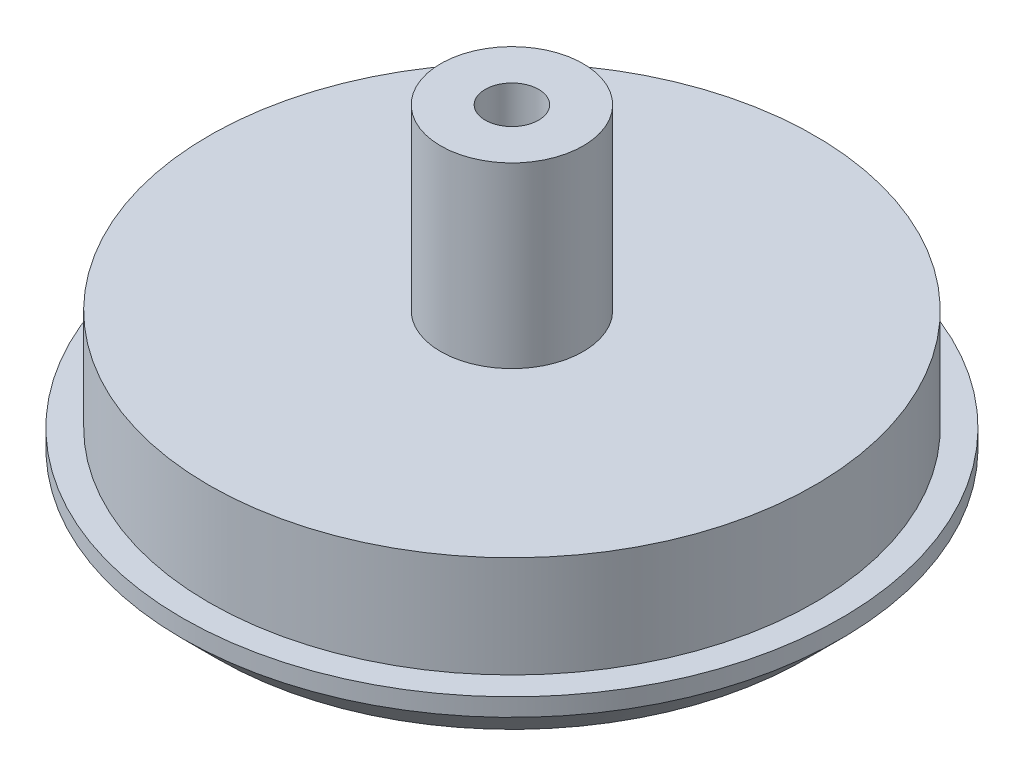
ISO-10303-21;
HEADER;
FILE_DESCRIPTION(('STEP AP214'),'2;1');
FILE_NAME('part.step','',(''),(''),'','','');
FILE_SCHEMA(('AUTOMOTIVE_DESIGN { 1 0 10303 214 1 1 1 1 }'));
ENDSEC;
DATA;
#1=APPLICATION_CONTEXT('core data for automotive mechanical design processes');
#2=APPLICATION_PROTOCOL_DEFINITION('international standard','automotive_design',2000,#1);
#3=PRODUCT_CONTEXT('',#1,'mechanical');
#4=PRODUCT('Part','Part','',(#3));
#5=PRODUCT_RELATED_PRODUCT_CATEGORY('part','',(#4));
#6=PRODUCT_DEFINITION_FORMATION('','',#4);
#7=PRODUCT_DEFINITION_CONTEXT('part definition',#1,'design');
#8=PRODUCT_DEFINITION('design','',#6,#7);
#9=PRODUCT_DEFINITION_SHAPE('','',#8);
#10=(LENGTH_UNIT() NAMED_UNIT(*) SI_UNIT(.MILLI.,.METRE.));
#11=(NAMED_UNIT(*) PLANE_ANGLE_UNIT() SI_UNIT($,.RADIAN.));
#12=(NAMED_UNIT(*) SI_UNIT($,.STERADIAN.) SOLID_ANGLE_UNIT());
#13=UNCERTAINTY_MEASURE_WITH_UNIT(LENGTH_MEASURE(1.E-05),#10,'distance_accuracy_value','');
#14=(GEOMETRIC_REPRESENTATION_CONTEXT(3) GLOBAL_UNCERTAINTY_ASSIGNED_CONTEXT((#13)) GLOBAL_UNIT_ASSIGNED_CONTEXT((#10,
#11,#12)) REPRESENTATION_CONTEXT('',''));
#15=CARTESIAN_POINT('',(0.,0.,0.));
#16=DIRECTION('',(0.,0.,1.));
#17=DIRECTION('',(1.,0.,0.));
#18=AXIS2_PLACEMENT_3D('',#15,#16,#17);
#19=CARTESIAN_POINT('',(0.,8.7,0.));
#20=DIRECTION('',(0.,-1.,0.));
#21=DIRECTION('',(0.,0.,-1.));
#22=AXIS2_PLACEMENT_3D('',#19,#20,#21);
#23=CYLINDRICAL_SURFACE('',#22,18.5);
#24=CARTESIAN_POINT('',(0.,2.00000000000001,0.));
#25=DIRECTION('',(0.,1.,0.));
#26=DIRECTION('',(0.,0.,1.));
#27=AXIS2_PLACEMENT_3D('',#24,#25,#26);
#28=CIRCLE('',#27,18.5);
#29=CARTESIAN_POINT('',(0.,2.00000000000001,18.5));
#30=VERTEX_POINT('',#29);
#31=EDGE_CURVE('E40',#30,#30,#28,.T.);
#32=ORIENTED_EDGE('',*,*,#31,.T.);
#33=EDGE_LOOP('',(#32));
#34=FACE_BOUND('',#33,.T.);
#35=CARTESIAN_POINT('',(0.,3.,0.));
#36=DIRECTION('',(0.,1.,0.));
#37=DIRECTION('',(0.,0.,1.));
#38=AXIS2_PLACEMENT_3D('',#35,#36,#37);
#39=CIRCLE('',#38,18.5);
#40=CARTESIAN_POINT('',(0.,3.,18.5));
#41=VERTEX_POINT('',#40);
#42=EDGE_CURVE('E53',#41,#41,#39,.F.);
#43=ORIENTED_EDGE('',*,*,#42,.T.);
#44=EDGE_LOOP('',(#43));
#45=FACE_BOUND('',#44,.T.);
#46=ADVANCED_FACE('F33',(#34,#45),#23,.T.);
#47=CARTESIAN_POINT('',(0.,0.,0.));
#48=DIRECTION('',(0.,1.,0.));
#49=DIRECTION('',(0.,0.,1.));
#50=AXIS2_PLACEMENT_3D('',#47,#48,#49);
#51=PLANE('',#50);
#52=CARTESIAN_POINT('',(0.,0.,0.));
#53=DIRECTION('',(0.,1.,0.));
#54=DIRECTION('',(0.,0.,1.));
#55=AXIS2_PLACEMENT_3D('',#52,#53,#54);
#56=CIRCLE('',#55,16.5);
#57=CARTESIAN_POINT('',(0.,0.,16.5));
#58=VERTEX_POINT('',#57);
#59=EDGE_CURVE('E11',#58,#58,#56,.F.);
#60=ORIENTED_EDGE('',*,*,#59,.T.);
#61=EDGE_LOOP('',(#60));
#62=FACE_BOUND('',#61,.T.);
#63=CARTESIAN_POINT('',(0.,0.,0.));
#64=DIRECTION('',(0.,-1.,0.));
#65=DIRECTION('',(0.,0.,-1.));
#66=AXIS2_PLACEMENT_3D('',#63,#64,#65);
#67=CIRCLE('',#66,14.2);
#68=CARTESIAN_POINT('',(0.,0.,-14.2));
#69=VERTEX_POINT('',#68);
#70=EDGE_CURVE('E60',#69,#69,#67,.T.);
#71=ORIENTED_EDGE('',*,*,#70,.F.);
#72=EDGE_LOOP('',(#71));
#73=FACE_BOUND('',#72,.T.);
#74=ADVANCED_FACE('F98',(#62,#73),#51,.F.);
#75=CARTESIAN_POINT('',(0.,-52.3259018078045,0.));
#76=DIRECTION('',(0.,1.,0.));
#77=DIRECTION('',(0.,0.,1.));
#78=AXIS2_PLACEMENT_3D('',#75,#76,#77);
#79=CYLINDRICAL_SURFACE('',#78,17.);
#80=CARTESIAN_POINT('',(0.,3.,0.));
#81=DIRECTION('',(0.,1.,0.));
#82=DIRECTION('',(0.,0.,1.));
#83=AXIS2_PLACEMENT_3D('',#80,#81,#82);
#84=CIRCLE('',#83,17.);
#85=CARTESIAN_POINT('',(0.,3.,17.));
#86=VERTEX_POINT('',#85);
#87=EDGE_CURVE('E48',#86,#86,#84,.F.);
#88=ORIENTED_EDGE('',*,*,#87,.F.);
#89=EDGE_LOOP('',(#88));
#90=FACE_BOUND('',#89,.T.);
#91=CARTESIAN_POINT('',(0.,8.7,0.));
#92=DIRECTION('',(0.,1.,0.));
#93=DIRECTION('',(0.,0.,1.));
#94=AXIS2_PLACEMENT_3D('',#91,#92,#93);
#95=CIRCLE('',#94,17.);
#96=CARTESIAN_POINT('',(0.,8.7,17.));
#97=VERTEX_POINT('',#96);
#98=EDGE_CURVE('E54',#97,#97,#95,.T.);
#99=ORIENTED_EDGE('',*,*,#98,.F.);
#100=EDGE_LOOP('',(#99));
#101=FACE_BOUND('',#100,.T.);
#102=ADVANCED_FACE('F100',(#90,#101),#79,.T.);
#103=CARTESIAN_POINT('',(0.,3.,0.));
#104=DIRECTION('',(0.,1.,0.));
#105=DIRECTION('',(0.,0.,1.));
#106=AXIS2_PLACEMENT_3D('',#103,#104,#105);
#107=PLANE('',#106);
#108=ORIENTED_EDGE('',*,*,#42,.F.);
#109=EDGE_LOOP('',(#108));
#110=FACE_BOUND('',#109,.T.);
#111=ORIENTED_EDGE('',*,*,#87,.T.);
#112=EDGE_LOOP('',(#111));
#113=FACE_BOUND('',#112,.T.);
#114=ADVANCED_FACE('F106',(#110,#113),#107,.T.);
#115=CARTESIAN_POINT('',(0.,8.7,0.));
#116=DIRECTION('',(0.,1.,0.));
#117=DIRECTION('',(0.,0.,1.));
#118=AXIS2_PLACEMENT_3D('',#115,#116,#117);
#119=PLANE('',#118);
#120=CARTESIAN_POINT('',(0.,8.7,0.));
#121=DIRECTION('',(0.,1.,0.));
#122=DIRECTION('',(0.,0.,1.));
#123=AXIS2_PLACEMENT_3D('',#120,#121,#122);
#124=CIRCLE('',#123,4.);
#125=CARTESIAN_POINT('',(0.,8.7,4.));
#126=VERTEX_POINT('',#125);
#127=EDGE_CURVE('E44',#126,#126,#124,.T.);
#128=ORIENTED_EDGE('',*,*,#127,.F.);
#129=EDGE_LOOP('',(#128));
#130=FACE_BOUND('',#129,.T.);
#131=ORIENTED_EDGE('',*,*,#98,.T.);
#132=EDGE_LOOP('',(#131));
#133=FACE_BOUND('',#132,.T.);
#134=ADVANCED_FACE('F94',(#130,#133),#119,.T.);
#135=CARTESIAN_POINT('',(0.,5.6,0.));
#136=DIRECTION('',(0.,-1.,0.));
#137=DIRECTION('',(0.,0.,-1.));
#138=AXIS2_PLACEMENT_3D('',#135,#136,#137);
#139=CYLINDRICAL_SURFACE('',#138,14.2);
#140=CARTESIAN_POINT('',(0.,5.6,0.));
#141=DIRECTION('',(0.,-1.,0.));
#142=DIRECTION('',(0.,0.,-1.));
#143=AXIS2_PLACEMENT_3D('',#140,#141,#142);
#144=CIRCLE('',#143,14.2);
#145=CARTESIAN_POINT('',(0.,5.6,-14.2));
#146=VERTEX_POINT('',#145);
#147=EDGE_CURVE('E57',#146,#146,#144,.T.);
#148=ORIENTED_EDGE('',*,*,#147,.F.);
#149=EDGE_LOOP('',(#148));
#150=FACE_BOUND('',#149,.T.);
#151=ORIENTED_EDGE('',*,*,#70,.T.);
#152=EDGE_LOOP('',(#151));
#153=FACE_BOUND('',#152,.T.);
#154=ADVANCED_FACE('F88',(#150,#153),#139,.F.);
#155=CARTESIAN_POINT('',(0.,5.6,0.));
#156=DIRECTION('',(0.,-1.,0.));
#157=DIRECTION('',(0.,0.,-1.));
#158=AXIS2_PLACEMENT_3D('',#155,#156,#157);
#159=PLANE('',#158);
#160=CARTESIAN_POINT('',(0.,5.6,0.));
#161=DIRECTION('',(0.,-1.,0.));
#162=DIRECTION('',(0.,0.,-1.));
#163=AXIS2_PLACEMENT_3D('',#160,#161,#162);
#164=CIRCLE('',#163,1.5);
#165=CARTESIAN_POINT('',(0.,5.6,-1.5));
#166=VERTEX_POINT('',#165);
#167=EDGE_CURVE('E69',#166,#166,#164,.T.);
#168=ORIENTED_EDGE('',*,*,#167,.F.);
#169=EDGE_LOOP('',(#168));
#170=FACE_BOUND('',#169,.T.);
#171=ORIENTED_EDGE('',*,*,#147,.T.);
#172=EDGE_LOOP('',(#171));
#173=FACE_BOUND('',#172,.T.);
#174=ADVANCED_FACE('F84',(#170,#173),#159,.T.);
#175=CARTESIAN_POINT('',(0.,18.7,0.));
#176=DIRECTION('',(0.,-1.,0.));
#177=DIRECTION('',(0.,0.,-1.));
#178=AXIS2_PLACEMENT_3D('',#175,#176,#177);
#179=CYLINDRICAL_SURFACE('',#178,4.);
#180=CARTESIAN_POINT('',(0.,18.7,0.));
#181=DIRECTION('',(0.,1.,0.));
#182=DIRECTION('',(0.,0.,1.));
#183=AXIS2_PLACEMENT_3D('',#180,#181,#182);
#184=CIRCLE('',#183,4.);
#185=CARTESIAN_POINT('',(0.,18.7,4.));
#186=VERTEX_POINT('',#185);
#187=EDGE_CURVE('E63',#186,#186,#184,.T.);
#188=ORIENTED_EDGE('',*,*,#187,.F.);
#189=EDGE_LOOP('',(#188));
#190=FACE_BOUND('',#189,.T.);
#191=ORIENTED_EDGE('',*,*,#127,.T.);
#192=EDGE_LOOP('',(#191));
#193=FACE_BOUND('',#192,.T.);
#194=ADVANCED_FACE('F87',(#190,#193),#179,.T.);
#195=CARTESIAN_POINT('',(0.,18.7,0.));
#196=DIRECTION('',(0.,1.,0.));
#197=DIRECTION('',(0.,0.,1.));
#198=AXIS2_PLACEMENT_3D('',#195,#196,#197);
#199=PLANE('',#198);
#200=CARTESIAN_POINT('',(0.,18.7,0.));
#201=DIRECTION('',(0.,-1.,0.));
#202=DIRECTION('',(0.,0.,-1.));
#203=AXIS2_PLACEMENT_3D('',#200,#201,#202);
#204=CIRCLE('',#203,1.5);
#205=CARTESIAN_POINT('',(0.,18.7,-1.5));
#206=VERTEX_POINT('',#205);
#207=EDGE_CURVE('E68',#206,#206,#204,.T.);
#208=ORIENTED_EDGE('',*,*,#207,.T.);
#209=EDGE_LOOP('',(#208));
#210=FACE_BOUND('',#209,.T.);
#211=ORIENTED_EDGE('',*,*,#187,.T.);
#212=EDGE_LOOP('',(#211));
#213=FACE_BOUND('',#212,.T.);
#214=ADVANCED_FACE('F75',(#210,#213),#199,.T.);
#215=CARTESIAN_POINT('',(0.,2.00000000000001,0.));
#216=DIRECTION('',(0.,1.,0.));
#217=DIRECTION('',(0.,0.,1.));
#218=AXIS2_PLACEMENT_3D('',#215,#216,#217);
#219=CONICAL_SURFACE('',#218,18.5,0.785398163397451);
#220=ORIENTED_EDGE('',*,*,#59,.F.);
#221=EDGE_LOOP('',(#220));
#222=FACE_BOUND('',#221,.T.);
#223=ORIENTED_EDGE('',*,*,#31,.F.);
#224=EDGE_LOOP('',(#223));
#225=FACE_BOUND('',#224,.T.);
#226=ADVANCED_FACE('F35',(#222,#225),#219,.T.);
#227=CARTESIAN_POINT('',(0.,18.7,0.));
#228=DIRECTION('',(0.,-1.,0.));
#229=DIRECTION('',(0.,0.,-1.));
#230=AXIS2_PLACEMENT_3D('',#227,#228,#229);
#231=CYLINDRICAL_SURFACE('',#230,1.5);
#232=CARTESIAN_POINT('',(0.,18.7,-1.5));
#233=CARTESIAN_POINT('',(0.,18.5635416666667,-1.5));
#234=CARTESIAN_POINT('',(0.,18.4270833333333,-1.5));
#235=CARTESIAN_POINT('',(0.,18.1541666666667,-1.5));
#236=CARTESIAN_POINT('',(0.,18.0177083333333,-1.5));
#237=CARTESIAN_POINT('',(0.,17.7447916666667,-1.5));
#238=CARTESIAN_POINT('',(0.,17.6083333333333,-1.5));
#239=CARTESIAN_POINT('',(0.,17.3354166666667,-1.5));
#240=CARTESIAN_POINT('',(0.,17.1989583333333,-1.5));
#241=CARTESIAN_POINT('',(0.,16.9260416666667,-1.5));
#242=CARTESIAN_POINT('',(0.,16.7895833333333,-1.5));
#243=CARTESIAN_POINT('',(0.,16.5166666666667,-1.5));
#244=CARTESIAN_POINT('',(0.,16.3802083333333,-1.5));
#245=CARTESIAN_POINT('',(0.,16.1072916666667,-1.5));
#246=CARTESIAN_POINT('',(0.,15.9708333333333,-1.5));
#247=CARTESIAN_POINT('',(0.,15.6979166666667,-1.5));
#248=CARTESIAN_POINT('',(0.,15.5614583333333,-1.5));
#249=CARTESIAN_POINT('',(0.,15.2885416666667,-1.5));
#250=CARTESIAN_POINT('',(0.,15.1520833333333,-1.5));
#251=CARTESIAN_POINT('',(0.,14.8791666666667,-1.5));
#252=CARTESIAN_POINT('',(0.,14.7427083333333,-1.5));
#253=CARTESIAN_POINT('',(0.,14.4697916666667,-1.5));
#254=CARTESIAN_POINT('',(0.,14.3333333333333,-1.5));
#255=CARTESIAN_POINT('',(0.,14.0604166666667,-1.5));
#256=CARTESIAN_POINT('',(0.,13.9239583333333,-1.5));
#257=CARTESIAN_POINT('',(0.,13.6510416666667,-1.5));
#258=CARTESIAN_POINT('',(0.,13.5145833333333,-1.5));
#259=CARTESIAN_POINT('',(0.,13.2416666666667,-1.5));
#260=CARTESIAN_POINT('',(0.,13.1052083333333,-1.5));
#261=CARTESIAN_POINT('',(0.,12.8322916666667,-1.5));
#262=CARTESIAN_POINT('',(0.,12.6958333333333,-1.5));
#263=CARTESIAN_POINT('',(0.,12.4229166666667,-1.5));
#264=CARTESIAN_POINT('',(0.,12.2864583333333,-1.5));
#265=CARTESIAN_POINT('',(0.,12.0135416666667,-1.5));
#266=CARTESIAN_POINT('',(0.,11.8770833333333,-1.5));
#267=CARTESIAN_POINT('',(0.,11.6041666666667,-1.5));
#268=CARTESIAN_POINT('',(0.,11.4677083333333,-1.5));
#269=CARTESIAN_POINT('',(0.,11.1947916666667,-1.5));
#270=CARTESIAN_POINT('',(0.,11.0583333333333,-1.5));
#271=CARTESIAN_POINT('',(0.,10.7854166666667,-1.5));
#272=CARTESIAN_POINT('',(0.,10.6489583333333,-1.5));
#273=CARTESIAN_POINT('',(0.,10.3760416666667,-1.5));
#274=CARTESIAN_POINT('',(0.,10.2395833333333,-1.5));
#275=CARTESIAN_POINT('',(0.,9.96666666666667,-1.5));
#276=CARTESIAN_POINT('',(0.,9.83020833333333,-1.5));
#277=CARTESIAN_POINT('',(0.,9.55729166666667,-1.5));
#278=CARTESIAN_POINT('',(0.,9.42083333333333,-1.5));
#279=CARTESIAN_POINT('',(0.,9.14791666666667,-1.5));
#280=CARTESIAN_POINT('',(0.,9.01145833333334,-1.5));
#281=CARTESIAN_POINT('',(0.,8.73854166666667,-1.5));
#282=CARTESIAN_POINT('',(0.,8.60208333333333,-1.5));
#283=CARTESIAN_POINT('',(0.,8.32916666666667,-1.5));
#284=CARTESIAN_POINT('',(0.,8.19270833333334,-1.5));
#285=CARTESIAN_POINT('',(0.,7.91979166666667,-1.5));
#286=CARTESIAN_POINT('',(0.,7.78333333333333,-1.5));
#287=CARTESIAN_POINT('',(0.,7.51041666666667,-1.5));
#288=CARTESIAN_POINT('',(0.,7.37395833333333,-1.5));
#289=CARTESIAN_POINT('',(0.,7.10104166666667,-1.5));
#290=CARTESIAN_POINT('',(0.,6.96458333333333,-1.5));
#291=CARTESIAN_POINT('',(0.,6.69166666666667,-1.5));
#292=CARTESIAN_POINT('',(0.,6.55520833333333,-1.5));
#293=CARTESIAN_POINT('',(0.,6.28229166666667,-1.5));
#294=CARTESIAN_POINT('',(0.,6.14583333333333,-1.5));
#295=CARTESIAN_POINT('',(0.,5.87291666666667,-1.5));
#296=CARTESIAN_POINT('',(0.,5.73645833333333,-1.5));
#297=CARTESIAN_POINT('',(0.,5.6,-1.5));
#298=B_SPLINE_CURVE_WITH_KNOTS('',3,(#232,#233,#234,#235,#236,#237,#238,#239,#240,#241,#242,
#243,#244,#245,#246,#247,#248,#249,#250,#251,#252,#253,#254,#255,#256,#257,#258,#259,#260,#261,
#262,#263,#264,#265,#266,#267,#268,#269,#270,#271,#272,#273,#274,#275,#276,#277,#278,#279,#280,
#281,#282,#283,#284,#285,#286,#287,#288,#289,#290,#291,#292,#293,#294,#295,#296,#297),
.UNSPECIFIED.,.F.,.F.,(4,2,2,2,2,2,2,2,2,2,2,2,2,2,2,2,2,2,2,2,2,2,2,2,2,2,2,2,2,2,2,2,4),(0.,
0.409375000000003,0.818750000000004,1.228125,1.6375,2.046875,2.45625,2.865625,3.275,3.684375,
4.09375,4.503125,4.9125,5.321875,5.73125,6.140625,6.55,6.959375,7.36875,7.778125,8.1875,
8.596875,9.00625,9.415625,9.825,10.234375,10.64375,11.053125,11.4625,11.871875,12.28125,
12.690625,13.1),.UNSPECIFIED.);
#299=EDGE_CURVE('BSEAM78',#206,#166,#298,.T.);
#300=ORIENTED_EDGE('',*,*,#207,.F.);
#301=ORIENTED_EDGE('',*,*,#167,.T.);
#302=ORIENTED_EDGE('',*,*,#299,.T.);
#303=ORIENTED_EDGE('',*,*,#299,.F.);
#304=EDGE_LOOP('',(#300,#302,#301,#303));
#305=FACE_BOUND('',#304,.T.);
#306=ADVANCED_FACE('F78',(#305),#231,.F.);
#307=CLOSED_SHELL('',(#46,#74,#102,#114,#134,#154,#174,#194,#214,#226,#306));
#308=MANIFOLD_SOLID_BREP('B2',#307);
#309=ADVANCED_BREP_SHAPE_REPRESENTATION('',(#18,#308),#14);
#310=SHAPE_DEFINITION_REPRESENTATION(#9,#309);
ENDSEC;
END-ISO-10303-21;
